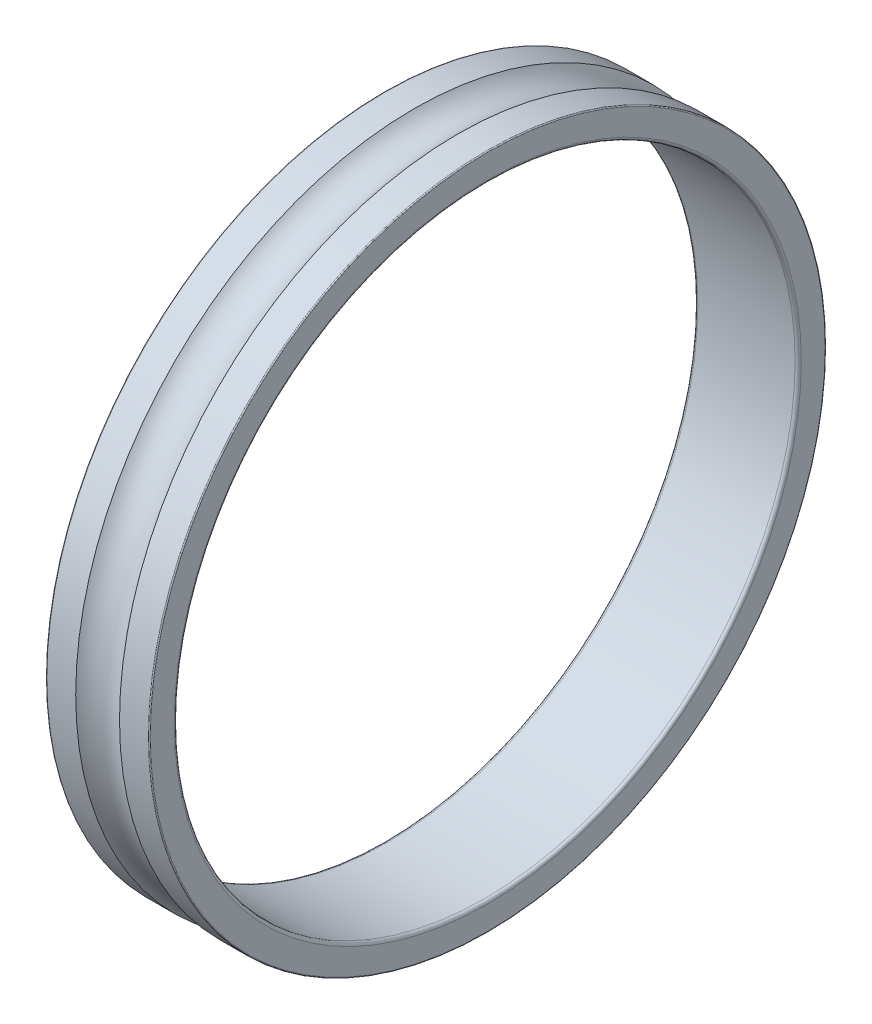
ISO-10303-21;
HEADER;
FILE_DESCRIPTION(('STEP AP214'),'2;1');
FILE_NAME('part.step','',(''),(''),'','','');
FILE_SCHEMA(('AUTOMOTIVE_DESIGN { 1 0 10303 214 1 1 1 1 }'));
ENDSEC;
DATA;
#1=APPLICATION_CONTEXT('core data for automotive mechanical design processes');
#2=APPLICATION_PROTOCOL_DEFINITION('international standard','automotive_design',2000,#1);
#3=PRODUCT_CONTEXT('',#1,'mechanical');
#4=PRODUCT('Part','Part','',(#3));
#5=PRODUCT_RELATED_PRODUCT_CATEGORY('part','',(#4));
#6=PRODUCT_DEFINITION_FORMATION('','',#4);
#7=PRODUCT_DEFINITION_CONTEXT('part definition',#1,'design');
#8=PRODUCT_DEFINITION('design','',#6,#7);
#9=PRODUCT_DEFINITION_SHAPE('','',#8);
#10=(LENGTH_UNIT() NAMED_UNIT(*) SI_UNIT(.MILLI.,.METRE.));
#11=(NAMED_UNIT(*) PLANE_ANGLE_UNIT() SI_UNIT($,.RADIAN.));
#12=(NAMED_UNIT(*) SI_UNIT($,.STERADIAN.) SOLID_ANGLE_UNIT());
#13=UNCERTAINTY_MEASURE_WITH_UNIT(LENGTH_MEASURE(1.E-05),#10,'distance_accuracy_value','');
#14=(GEOMETRIC_REPRESENTATION_CONTEXT(3) GLOBAL_UNCERTAINTY_ASSIGNED_CONTEXT((#13)) GLOBAL_UNIT_ASSIGNED_CONTEXT((#10,
#11,#12)) REPRESENTATION_CONTEXT('',''));
#15=CARTESIAN_POINT('',(0.,0.,0.));
#16=DIRECTION('',(0.,0.,1.));
#17=DIRECTION('',(1.,0.,0.));
#18=AXIS2_PLACEMENT_3D('',#15,#16,#17);
#19=CARTESIAN_POINT('',(0.,-32.9612223399315,-32.6));
#20=DIRECTION('',(-1.,0.,0.));
#21=DIRECTION('',(0.,0.,1.));
#22=AXIS2_PLACEMENT_3D('',#19,#20,#21);
#23=PLANE('',#22);
#24=CARTESIAN_POINT('',(0.,0.,0.));
#25=DIRECTION('',(-1.,0.,0.));
#26=DIRECTION('',(0.,0.,-1.));
#27=AXIS2_PLACEMENT_3D('',#24,#25,#26);
#28=CIRCLE('',#27,32.6);
#29=CARTESIAN_POINT('',(0.,0.,-32.6));
#30=VERTEX_POINT('',#29);
#31=EDGE_CURVE('E50',#30,#30,#28,.F.);
#32=ORIENTED_EDGE('',*,*,#31,.F.);
#33=EDGE_LOOP('',(#32));
#34=FACE_BOUND('',#33,.T.);
#35=CARTESIAN_POINT('',(0.,0.,0.));
#36=DIRECTION('',(1.,0.,0.));
#37=DIRECTION('',(0.,0.,1.));
#38=AXIS2_PLACEMENT_3D('',#35,#36,#37);
#39=CIRCLE('',#38,30.300000039481);
#40=CARTESIAN_POINT('',(0.,0.,30.300000039481));
#41=VERTEX_POINT('',#40);
#42=EDGE_CURVE('E47',#41,#41,#39,.T.);
#43=ORIENTED_EDGE('',*,*,#42,.T.);
#44=EDGE_LOOP('',(#43));
#45=FACE_BOUND('',#44,.T.);
#46=ADVANCED_FACE('F15',(#34,#45),#23,.T.);
#47=CARTESIAN_POINT('',(10.,-32.9612222874647,32.6));
#48=DIRECTION('',(1.,0.,0.));
#49=DIRECTION('',(0.,0.,-1.));
#50=AXIS2_PLACEMENT_3D('',#47,#48,#49);
#51=PLANE('',#50);
#52=CARTESIAN_POINT('',(10.,0.,0.));
#53=DIRECTION('',(1.,0.,0.));
#54=DIRECTION('',(0.,-1.16846638704173E-09,1.));
#55=AXIS2_PLACEMENT_3D('',#52,#53,#54);
#56=CIRCLE('',#55,32.600000031751);
#57=CARTESIAN_POINT('',(10.,-3.80920042546603E-08,32.600000031751));
#58=VERTEX_POINT('',#57);
#59=EDGE_CURVE('E44',#58,#58,#56,.T.);
#60=ORIENTED_EDGE('',*,*,#59,.T.);
#61=EDGE_LOOP('',(#60));
#62=FACE_BOUND('',#61,.T.);
#63=CARTESIAN_POINT('',(10.,0.,0.));
#64=DIRECTION('',(-1.,0.,0.));
#65=DIRECTION('',(0.,0.,-1.));
#66=AXIS2_PLACEMENT_3D('',#63,#64,#65);
#67=CIRCLE('',#66,30.3);
#68=CARTESIAN_POINT('',(10.,0.,-30.3));
#69=VERTEX_POINT('',#68);
#70=EDGE_CURVE('E41',#69,#69,#67,.F.);
#71=ORIENTED_EDGE('',*,*,#70,.F.);
#72=EDGE_LOOP('',(#71));
#73=FACE_BOUND('',#72,.T.);
#74=ADVANCED_FACE('F58',(#62,#73),#51,.T.);
#75=CARTESIAN_POINT('',(0.299999999999948,0.,0.));
#76=DIRECTION('',(1.,0.,0.));
#77=DIRECTION('',(0.,0.,1.));
#78=AXIS2_PLACEMENT_3D('',#75,#76,#77);
#79=TOROIDAL_SURFACE('',#78,30.3,0.299999999999948);
#80=CARTESIAN_POINT('',(0.299999999999994,0.,0.));
#81=DIRECTION('',(1.,0.,0.));
#82=DIRECTION('',(0.,0.,1.));
#83=AXIS2_PLACEMENT_3D('',#80,#81,#82);
#84=CIRCLE('',#83,30.0000000000001);
#85=CARTESIAN_POINT('',(0.299999999999994,0.,30.0000000000001));
#86=VERTEX_POINT('',#85);
#87=EDGE_CURVE('E38',#86,#86,#84,.T.);
#88=ORIENTED_EDGE('',*,*,#87,.T.);
#89=EDGE_LOOP('',(#88));
#90=FACE_BOUND('',#89,.T.);
#91=ORIENTED_EDGE('',*,*,#42,.F.);
#92=EDGE_LOOP('',(#91));
#93=FACE_BOUND('',#92,.T.);
#94=ADVANCED_FACE('F62',(#90,#93),#79,.T.);
#95=CARTESIAN_POINT('',(100.,0.,0.));
#96=DIRECTION('',(1.,0.,0.));
#97=DIRECTION('',(0.,0.,1.));
#98=AXIS2_PLACEMENT_3D('',#95,#96,#97);
#99=CYLINDRICAL_SURFACE('',#98,30.);
#100=CARTESIAN_POINT('',(9.7,0.,0.));
#101=DIRECTION('',(1.,0.,0.));
#102=DIRECTION('',(0.,-1.9234201974874E-10,1.));
#103=AXIS2_PLACEMENT_3D('',#100,#101,#102);
#104=CIRCLE('',#103,30.);
#105=CARTESIAN_POINT('',(9.7,-5.77026059246219E-09,30.));
#106=VERTEX_POINT('',#105);
#107=EDGE_CURVE('E35',#106,#106,#104,.T.);
#108=ORIENTED_EDGE('',*,*,#107,.T.);
#109=EDGE_LOOP('',(#108));
#110=FACE_BOUND('',#109,.T.);
#111=ORIENTED_EDGE('',*,*,#87,.F.);
#112=EDGE_LOOP('',(#111));
#113=FACE_BOUND('',#112,.T.);
#114=ADVANCED_FACE('F64',(#110,#113),#99,.F.);
#115=CARTESIAN_POINT('',(9.70000000000011,0.,0.));
#116=DIRECTION('',(1.,0.,0.));
#117=DIRECTION('',(0.,0.,1.));
#118=AXIS2_PLACEMENT_3D('',#115,#116,#117);
#119=TOROIDAL_SURFACE('',#118,30.3,0.299999999999887);
#120=ORIENTED_EDGE('',*,*,#70,.T.);
#121=EDGE_LOOP('',(#120));
#122=FACE_BOUND('',#121,.T.);
#123=ORIENTED_EDGE('',*,*,#107,.F.);
#124=EDGE_LOOP('',(#123));
#125=FACE_BOUND('',#124,.T.);
#126=ADVANCED_FACE('F72',(#122,#125),#119,.T.);
#127=CARTESIAN_POINT('',(9.90000000000067,0.,0.));
#128=DIRECTION('',(1.,0.,0.));
#129=DIRECTION('',(0.,0.,1.));
#130=AXIS2_PLACEMENT_3D('',#127,#128,#129);
#131=TOROIDAL_SURFACE('',#130,32.6000000000006,0.099999999999335);
#132=CARTESIAN_POINT('',(9.90000000000067,0.,0.));
#133=DIRECTION('',(1.,0.,0.));
#134=DIRECTION('',(0.,0.,1.));
#135=AXIS2_PLACEMENT_3D('',#132,#133,#134);
#136=CIRCLE('',#135,32.7);
#137=CARTESIAN_POINT('',(9.90000000000067,0.,32.7));
#138=VERTEX_POINT('',#137);
#139=EDGE_CURVE('E30',#138,#138,#136,.T.);
#140=ORIENTED_EDGE('',*,*,#139,.T.);
#141=EDGE_LOOP('',(#140));
#142=FACE_BOUND('',#141,.T.);
#143=ORIENTED_EDGE('',*,*,#59,.F.);
#144=EDGE_LOOP('',(#143));
#145=FACE_BOUND('',#144,.T.);
#146=ADVANCED_FACE('F80',(#142,#145),#131,.T.);
#147=CARTESIAN_POINT('',(100.,0.,0.));
#148=DIRECTION('',(1.,0.,0.));
#149=DIRECTION('',(0.,0.,1.));
#150=AXIS2_PLACEMENT_3D('',#147,#148,#149);
#151=CYLINDRICAL_SURFACE('',#150,32.7);
#152=CARTESIAN_POINT('',(7.11595935688759,0.,0.));
#153=DIRECTION('',(1.,0.,0.));
#154=DIRECTION('',(0.,0.,1.));
#155=AXIS2_PLACEMENT_3D('',#152,#153,#154);
#156=CIRCLE('',#155,32.7);
#157=CARTESIAN_POINT('',(7.11595935688759,0.,32.7));
#158=VERTEX_POINT('',#157);
#159=EDGE_CURVE('E26',#158,#158,#156,.T.);
#160=ORIENTED_EDGE('',*,*,#159,.T.);
#161=EDGE_LOOP('',(#160));
#162=FACE_BOUND('',#161,.T.);
#163=ORIENTED_EDGE('',*,*,#139,.F.);
#164=EDGE_LOOP('',(#163));
#165=FACE_BOUND('',#164,.T.);
#166=ADVANCED_FACE('F84',(#162,#165),#151,.T.);
#167=CARTESIAN_POINT('',(5.,0.,0.));
#168=DIRECTION('',(1.,0.,0.));
#169=DIRECTION('',(0.,0.,1.));
#170=AXIS2_PLACEMENT_3D('',#167,#168,#169);
#171=TOROIDAL_SURFACE('',#170,34.5,2.77800000000009);
#172=ORIENTED_EDGE('',*,*,#159,.F.);
#173=EDGE_LOOP('',(#172));
#174=FACE_BOUND('',#173,.T.);
#175=CARTESIAN_POINT('',(2.88404064311236,0.,0.));
#176=DIRECTION('',(1.,0.,0.));
#177=DIRECTION('',(0.,0.,1.));
#178=AXIS2_PLACEMENT_3D('',#175,#176,#177);
#179=CIRCLE('',#178,32.7);
#180=CARTESIAN_POINT('',(2.88404064311236,0.,32.7));
#181=VERTEX_POINT('',#180);
#182=EDGE_CURVE('E22',#181,#181,#179,.T.);
#183=ORIENTED_EDGE('',*,*,#182,.T.);
#184=EDGE_LOOP('',(#183));
#185=FACE_BOUND('',#184,.T.);
#186=ADVANCED_FACE('F88',(#174,#185),#171,.F.);
#187=CARTESIAN_POINT('',(100.,0.,0.));
#188=DIRECTION('',(1.,0.,0.));
#189=DIRECTION('',(0.,0.,1.));
#190=AXIS2_PLACEMENT_3D('',#187,#188,#189);
#191=CYLINDRICAL_SURFACE('',#190,32.7);
#192=CARTESIAN_POINT('',(0.100000000000009,0.,0.));
#193=DIRECTION('',(1.,0.,0.));
#194=DIRECTION('',(0.,0.,1.));
#195=AXIS2_PLACEMENT_3D('',#192,#193,#194);
#196=CIRCLE('',#195,32.7);
#197=CARTESIAN_POINT('',(0.100000000000009,0.,32.7));
#198=VERTEX_POINT('',#197);
#199=EDGE_CURVE('E10',#198,#198,#196,.T.);
#200=ORIENTED_EDGE('',*,*,#199,.T.);
#201=EDGE_LOOP('',(#200));
#202=FACE_BOUND('',#201,.T.);
#203=ORIENTED_EDGE('',*,*,#182,.F.);
#204=EDGE_LOOP('',(#203));
#205=FACE_BOUND('',#204,.T.);
#206=ADVANCED_FACE('F91',(#202,#205),#191,.T.);
#207=CARTESIAN_POINT('',(0.0999999999994113,0.,0.));
#208=DIRECTION('',(1.,0.,0.));
#209=DIRECTION('',(0.,0.,1.));
#210=AXIS2_PLACEMENT_3D('',#207,#208,#209);
#211=TOROIDAL_SURFACE('',#210,32.6000000000006,0.0999999999994061);
#212=ORIENTED_EDGE('',*,*,#31,.T.);
#213=EDGE_LOOP('',(#212));
#214=FACE_BOUND('',#213,.T.);
#215=ORIENTED_EDGE('',*,*,#199,.F.);
#216=EDGE_LOOP('',(#215));
#217=FACE_BOUND('',#216,.T.);
#218=ADVANCED_FACE('F17',(#214,#217),#211,.T.);
#219=CLOSED_SHELL('',(#46,#74,#94,#114,#126,#146,#166,#186,#206,#218));
#220=MANIFOLD_SOLID_BREP('B1',#219);
#221=ADVANCED_BREP_SHAPE_REPRESENTATION('',(#18,#220),#14);
#222=SHAPE_DEFINITION_REPRESENTATION(#9,#221);
ENDSEC;
END-ISO-10303-21;
